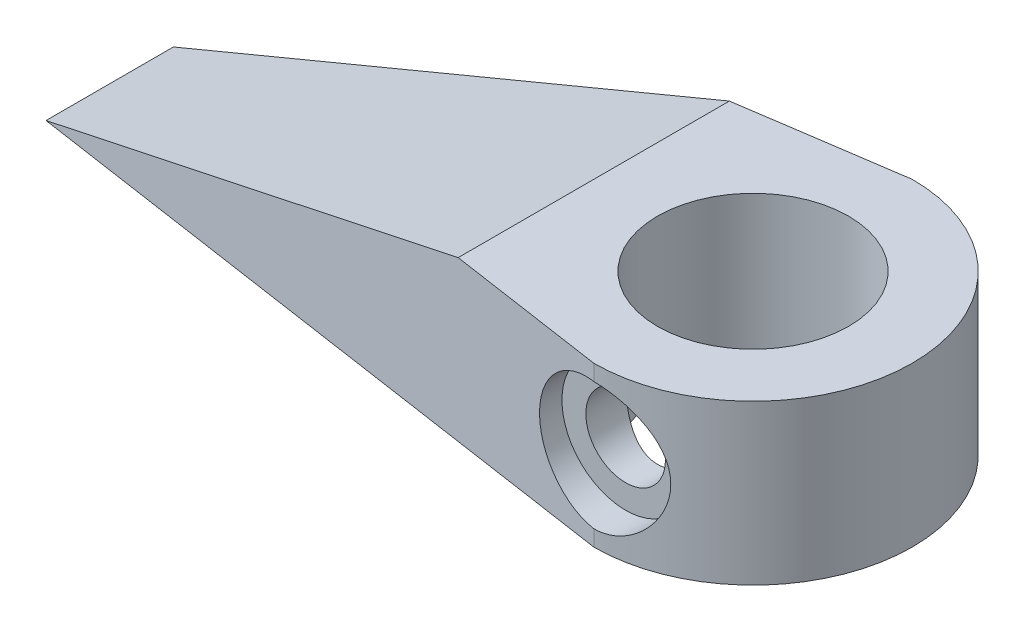
ISO-10303-21;
HEADER;
FILE_DESCRIPTION(('STEP AP214'),'2;1');
FILE_NAME('part.step','',(''),(''),'','','');
FILE_SCHEMA(('AUTOMOTIVE_DESIGN { 1 0 10303 214 1 1 1 1 }'));
ENDSEC;
DATA;
#1=APPLICATION_CONTEXT('core data for automotive mechanical design processes');
#2=APPLICATION_PROTOCOL_DEFINITION('international standard','automotive_design',2000,#1);
#3=PRODUCT_CONTEXT('',#1,'mechanical');
#4=PRODUCT('Part','Part','',(#3));
#5=PRODUCT_RELATED_PRODUCT_CATEGORY('part','',(#4));
#6=PRODUCT_DEFINITION_FORMATION('','',#4);
#7=PRODUCT_DEFINITION_CONTEXT('part definition',#1,'design');
#8=PRODUCT_DEFINITION('design','',#6,#7);
#9=PRODUCT_DEFINITION_SHAPE('','',#8);
#10=(LENGTH_UNIT() NAMED_UNIT(*) SI_UNIT(.MILLI.,.METRE.));
#11=(NAMED_UNIT(*) PLANE_ANGLE_UNIT() SI_UNIT($,.RADIAN.));
#12=(NAMED_UNIT(*) SI_UNIT($,.STERADIAN.) SOLID_ANGLE_UNIT());
#13=UNCERTAINTY_MEASURE_WITH_UNIT(LENGTH_MEASURE(1.E-05),#10,'distance_accuracy_value','');
#14=(GEOMETRIC_REPRESENTATION_CONTEXT(3) GLOBAL_UNCERTAINTY_ASSIGNED_CONTEXT((#13)) GLOBAL_UNIT_ASSIGNED_CONTEXT((#10,
#11,#12)) REPRESENTATION_CONTEXT('',''));
#15=CARTESIAN_POINT('',(0.,0.,0.));
#16=DIRECTION('',(0.,0.,1.));
#17=DIRECTION('',(1.,0.,0.));
#18=AXIS2_PLACEMENT_3D('',#15,#16,#17);
#19=CARTESIAN_POINT('',(20.1986841535707,2.5,-3.001));
#20=DIRECTION('',(0.,0.,1.));
#21=DIRECTION('',(1.,0.,0.));
#22=AXIS2_PLACEMENT_3D('',#19,#20,#21);
#23=CYLINDRICAL_SURFACE('',#22,1.25);
#24=CARTESIAN_POINT('',(21.4486841535707,2.5,4.72717802865892));
#25=CARTESIAN_POINT('',(21.4486767442363,2.43332810910315,4.72718519563219));
#26=CARTESIAN_POINT('',(21.4433161923857,2.36654734317378,4.729658595344));
#27=CARTESIAN_POINT('',(21.4220809430485,2.23491305794286,4.73923833650883));
#28=CARTESIAN_POINT('',(21.4061776936034,2.17006527332476,4.74635725824266));
#29=CARTESIAN_POINT('',(21.3645840377652,2.04443887030893,4.76426917574767));
#30=CARTESIAN_POINT('',(21.3389335278849,1.98364483628498,4.77504717562615));
#31=CARTESIAN_POINT('',(21.2786905311153,1.86724055042195,4.79904148565792));
#32=CARTESIAN_POINT('',(21.244100159486,1.81162907656688,4.81225721880782));
#33=CARTESIAN_POINT('',(21.1646580362468,1.70367427502653,4.84055762619856));
#34=CARTESIAN_POINT('',(21.1193373917551,1.65169244125591,4.85570568079145));
#35=CARTESIAN_POINT('',(21.0207058293162,1.55579977750244,4.88564295372226));
#36=CARTESIAN_POINT('',(20.9673918449447,1.51189205938699,4.90043203180788));
#37=CARTESIAN_POINT('',(20.851447547368,1.43155046912072,4.92875537930613));
#38=CARTESIAN_POINT('',(20.7885134472543,1.39552337196765,4.9422073997529));
#39=CARTESIAN_POINT('',(20.656816175933,1.3347239794944,4.96556519993425));
#40=CARTESIAN_POINT('',(20.5880556084428,1.30994668803578,4.97547255347156));
#41=CARTESIAN_POINT('',(20.4504526515958,1.27366054124326,4.99017521042366));
#42=CARTESIAN_POINT('',(20.3818007297667,1.26152830509795,4.99520971127466));
#43=CARTESIAN_POINT('',(20.2432633339357,1.24886235884014,5.00046828611204));
#44=CARTESIAN_POINT('',(20.1733783718061,1.24832394411704,5.00069431131014));
#45=CARTESIAN_POINT('',(20.0388913734581,1.25853428093332,4.99645129133056));
#46=CARTESIAN_POINT('',(19.9742266649633,1.26859810052573,4.99226714648663));
#47=CARTESIAN_POINT('',(19.8476012596392,1.29855310263816,4.98006516750308));
#48=CARTESIAN_POINT('',(19.7856407625157,1.31844500963016,4.97204705074576));
#49=CARTESIAN_POINT('',(19.6650460354931,1.36772804089464,4.95279852414028));
#50=CARTESIAN_POINT('',(19.6064769764958,1.39725946287082,4.94152097126084));
#51=CARTESIAN_POINT('',(19.4949723862887,1.46484575670034,4.91685713989805));
#52=CARTESIAN_POINT('',(19.4420388558137,1.50290364084498,4.90347011666254));
#53=CARTESIAN_POINT('',(19.3393432418627,1.58958242040462,4.8748169877706));
#54=CARTESIAN_POINT('',(19.2900677162544,1.63875879127901,4.85948494356009));
#55=CARTESIAN_POINT('',(19.200252738643,1.74471144070658,4.8293786068147));
#56=CARTESIAN_POINT('',(19.1597166577464,1.80149063829209,4.8146045313137));
#57=CARTESIAN_POINT('',(19.08728226107,1.92339503666191,4.78681612355338));
#58=CARTESIAN_POINT('',(19.0557116200153,1.98873320574328,4.77387558556714));
#59=CARTESIAN_POINT('',(19.0042198329867,2.1244810449745,4.7520984422101));
#60=CARTESIAN_POINT('',(18.9842903572975,2.19488704826954,4.74325890334593));
#61=CARTESIAN_POINT('',(18.9578839018894,2.333896808914,4.73141212519723));
#62=CARTESIAN_POINT('',(18.950618007242,2.40232112225905,4.72806369197116));
#63=CARTESIAN_POINT('',(18.9474278483807,2.5394784824115,4.72660286810641));
#64=CARTESIAN_POINT('',(18.9514996603892,2.60821141419171,4.72848866599318));
#65=CARTESIAN_POINT('',(18.9701493779151,2.73939838543045,4.73693131345748));
#66=CARTESIAN_POINT('',(18.9840379653902,2.8019726867868,4.74318138016617));
#67=CARTESIAN_POINT('',(19.0210135679284,2.92385129649787,4.75925630297446));
#68=CARTESIAN_POINT('',(19.0441027330394,2.98315483683071,4.7690819946016));
#69=CARTESIAN_POINT('',(19.0999089455188,3.09961531035647,4.79170797856999));
#70=CARTESIAN_POINT('',(19.1329923205087,3.15657497461032,4.80461662202281));
#71=CARTESIAN_POINT('',(19.2074833691847,3.26440805249902,4.83180003740793));
#72=CARTESIAN_POINT('',(19.2488946456947,3.31527881670187,4.84607539920582));
#73=CARTESIAN_POINT('',(19.3428396978552,3.413800134884,4.87578619784532));
#74=CARTESIAN_POINT('',(19.3960044920909,3.46085139995066,4.89122146708841));
#75=CARTESIAN_POINT('',(19.5098326410171,3.54547229197933,4.92043361183923));
#76=CARTESIAN_POINT('',(19.570496544767,3.5830412240637,4.93421036577013));
#77=CARTESIAN_POINT('',(19.6980294727673,3.64758987544358,4.95864251585649));
#78=CARTESIAN_POINT('',(19.7649139839322,3.67454224128948,4.96928983138825));
#79=CARTESIAN_POINT('',(19.9028253184162,3.71661679233443,4.98618173103365));
#80=CARTESIAN_POINT('',(19.9738496493455,3.73174601822607,4.99242893519919));
#81=CARTESIAN_POINT('',(20.1126676200643,3.74885812552031,4.99951534797509));
#82=CARTESIAN_POINT('',(20.1803400687768,3.75168599969697,5.00070204534225));
#83=CARTESIAN_POINT('',(20.315170965285,3.74638685870606,4.99849523480952));
#84=CARTESIAN_POINT('',(20.3823295011118,3.73826176398713,4.99510252984312));
#85=CARTESIAN_POINT('',(20.5117706360199,3.71189392784134,4.98430065981734));
#86=CARTESIAN_POINT('',(20.5741416914142,3.69402031953045,4.97703824209233));
#87=CARTESIAN_POINT('',(20.694976384072,3.64906575279087,4.95929499847057));
#88=CARTESIAN_POINT('',(20.7534392765565,3.6219830453351,4.94881356124206));
#89=CARTESIAN_POINT('',(20.8677087190494,3.55801047078554,4.92505825398662));
#90=CARTESIAN_POINT('',(20.9232758115473,3.52073269857601,4.91167959188765));
#91=CARTESIAN_POINT('',(21.0276028292094,3.43799281712811,4.8837156187423));
#92=CARTESIAN_POINT('',(21.0763602153567,3.39252766959325,4.86912986083797));
#93=CARTESIAN_POINT('',(21.1691339408022,3.2910551741456,4.8391484525914));
#94=CARTESIAN_POINT('',(21.2126019072191,3.23454098537888,4.82376522857895));
#95=CARTESIAN_POINT('',(21.2895174766374,3.11454125931981,4.79495552690185));
#96=CARTESIAN_POINT('',(21.3229594781382,3.05105185194186,4.78153014522557));
#97=CARTESIAN_POINT('',(21.3785118140064,2.91905616497725,4.75842557732642));
#98=CARTESIAN_POINT('',(21.4006823898992,2.85057884120679,4.74872654469864));
#99=CARTESIAN_POINT('',(21.4329197181087,2.71046042614933,4.73440803066667));
#100=CARTESIAN_POINT('',(21.4430270687828,2.6388307927257,4.7297715160498));
#101=CARTESIAN_POINT('',(21.4480888028072,2.54464147573811,4.72744979732687));
#102=CARTESIAN_POINT('',(21.4486866347819,2.52232684261197,4.72717562860874));
#103=CARTESIAN_POINT('',(21.4486841535707,2.5,4.72717802865892));
#104=B_SPLINE_CURVE_WITH_KNOTS('',3,(#24,#25,#26,#27,#28,#29,#30,#31,#32,#33,#34,#35,#36,#37,
#38,#39,#40,#41,#42,#43,#44,#45,#46,#47,#48,#49,#50,#51,#52,#53,#54,#55,#56,#57,#58,#59,#60,#61,
#62,#63,#64,#65,#66,#67,#68,#69,#70,#71,#72,#73,#74,#75,#76,#77,#78,#79,#80,#81,#82,#83,#84,#85,
#86,#87,#88,#89,#90,#91,#92,#93,#94,#95,#96,#97,#98,#99,#100,#101,#102,#103),.UNSPECIFIED.,.T.,
.F.,(4,2,2,2,2,2,2,2,2,2,2,2,2,2,2,2,2,2,2,2,2,2,2,2,2,2,2,2,2,2,2,2,2,2,2,2,2,2,2,4),(0.,
0.199951711985515,0.400447161842176,0.600130652152112,0.799766938550101,1.01066841430654,
1.2216510045991,1.44178476577924,1.66182066774891,1.87040605977952,2.07890680917931,
2.27471840245093,2.47054443201884,2.66935814640065,2.86824221022484,3.08114531844485,
3.29413040441367,3.51411545666722,3.73394290745569,3.93950778306308,4.14500152518449,
4.33733901066192,4.5297214691353,4.73025126818169,4.93086800795466,5.14781662735514,
5.36478114041867,5.58230105955595,5.79969134643008,6.00188635094055,6.20404590801915,
6.39903415036488,6.59405944632174,6.79789862829037,7.00181361048905,7.21960426908078,
7.4375163813919,7.65425125796866,7.87025464546164,7.93721375436707),.UNSPECIFIED.);
#105=CARTESIAN_POINT('',(21.4486841535707,2.5,4.72717802865892));
#106=VERTEX_POINT('',#105);
#107=EDGE_CURVE('E121',#106,#106,#104,.T.);
#108=ORIENTED_EDGE('',*,*,#107,.T.);
#109=EDGE_LOOP('',(#108));
#110=FACE_BOUND('',#109,.T.);
#111=CARTESIAN_POINT('',(20.1986841535707,2.5,6.));
#112=DIRECTION('',(0.,0.,1.));
#113=DIRECTION('',(1.,0.,0.));
#114=AXIS2_PLACEMENT_3D('',#111,#112,#113);
#115=CIRCLE('',#114,1.25);
#116=CARTESIAN_POINT('',(21.4486841535707,2.5,6.));
#117=VERTEX_POINT('',#116);
#118=EDGE_CURVE('E116',#117,#117,#115,.F.);
#119=ORIENTED_EDGE('',*,*,#118,.F.);
#120=EDGE_LOOP('',(#119));
#121=FACE_BOUND('',#120,.T.);
#122=ADVANCED_FACE('F33',(#110,#121),#23,.F.);
#123=CARTESIAN_POINT('',(0.,5.,4.));
#124=DIRECTION('',(0.146912950004832,0.,-0.989149425072308));
#125=DIRECTION('',(-0.989149425072308,0.,-0.146912950004832));
#126=AXIS2_PLACEMENT_3D('',#123,#124,#125);
#127=PLANE('',#126);
#128=DIRECTION('',(0.,-1.,0.));
#129=VECTOR('',#128,1.);
#130=CARTESIAN_POINT('',(20.1986841535707,5.,7.));
#131=LINE('',#130,#129);
#132=CARTESIAN_POINT('',(20.1986841535707,0.499999999999997,7.));
#133=VERTEX_POINT('',#132);
#134=CARTESIAN_POINT('',(20.1986841535707,0.,7.));
#135=VERTEX_POINT('',#134);
#136=EDGE_CURVE('E78',#133,#135,#131,.T.);
#137=ORIENTED_EDGE('',*,*,#136,.F.);
#138=CARTESIAN_POINT('',(20.1986841535707,2.5,7.));
#139=DIRECTION('',(0.146912950004832,0.,-0.989149425072308));
#140=DIRECTION('',(0.989149425072308,0.,0.146912950004832));
#141=AXIS2_PLACEMENT_3D('',#138,#139,#140);
#142=ELLIPSE('',#141,2.02193920281943,2.);
#143=CARTESIAN_POINT('',(20.1986841535707,4.5,7.));
#144=VERTEX_POINT('',#143);
#145=EDGE_CURVE('E53',#133,#144,#142,.T.);
#146=ORIENTED_EDGE('',*,*,#145,.T.);
#147=CARTESIAN_POINT('',(20.1986841535707,5.,7.));
#148=VERTEX_POINT('',#147);
#149=EDGE_CURVE('E86',#148,#144,#131,.T.);
#150=ORIENTED_EDGE('',*,*,#149,.F.);
#151=DIRECTION('',(0.989149425072308,0.,0.146912950004832));
#152=VECTOR('',#151,1.);
#153=CARTESIAN_POINT('',(0.,5.,4.));
#154=LINE('',#153,#152);
#155=CARTESIAN_POINT('',(15.1986841535707,5.,6.25737736745845));
#156=VERTEX_POINT('',#155);
#157=EDGE_CURVE('E61',#156,#148,#154,.T.);
#158=ORIENTED_EDGE('',*,*,#157,.F.);
#159=DIRECTION('',(-0.940602408551378,-0.30943547449481,-0.13970252736267));
#160=VECTOR('',#159,1.);
#161=CARTESIAN_POINT('',(15.296399538862,5.03214600168803,6.27189049879142));
#162=LINE('',#161,#160);
#163=CARTESIAN_POINT('',(0.,0.,4.));
#164=VERTEX_POINT('',#163);
#165=EDGE_CURVE('E94',#156,#164,#162,.T.);
#166=ORIENTED_EDGE('',*,*,#165,.T.);
#167=DIRECTION('',(0.989149425072308,0.,0.146912950004832));
#168=VECTOR('',#167,1.);
#169=CARTESIAN_POINT('',(0.,0.,4.));
#170=LINE('',#169,#168);
#171=EDGE_CURVE('E90',#164,#135,#170,.T.);
#172=ORIENTED_EDGE('',*,*,#171,.T.);
#173=EDGE_LOOP('',(#137,#146,#150,#158,#166,#172));
#174=FACE_BOUND('',#173,.T.);
#175=ADVANCED_FACE('F91',(#174),#127,.F.);
#176=CARTESIAN_POINT('',(20.1986841535707,5.,2.));
#177=DIRECTION('',(0.,1.,0.));
#178=DIRECTION('',(0.,0.,1.));
#179=AXIS2_PLACEMENT_3D('',#176,#177,#178);
#180=PLANE('',#179);
#181=CARTESIAN_POINT('',(20.1986841535707,5.,2.));
#182=DIRECTION('',(0.,1.,0.));
#183=DIRECTION('',(0.,0.,1.));
#184=AXIS2_PLACEMENT_3D('',#181,#182,#183);
#185=CIRCLE('',#184,2.99999999999999);
#186=CARTESIAN_POINT('',(20.1986841535707,5.,4.99999999999999));
#187=VERTEX_POINT('',#186);
#188=EDGE_CURVE('E165',#187,#187,#185,.T.);
#189=ORIENTED_EDGE('',*,*,#188,.F.);
#190=EDGE_LOOP('',(#189));
#191=FACE_BOUND('',#190,.T.);
#192=DIRECTION('',(0.,0.,-1.));
#193=VECTOR('',#192,1.);
#194=CARTESIAN_POINT('',(15.1986841535707,5.,4.));
#195=LINE('',#194,#193);
#196=CARTESIAN_POINT('',(15.1986841535707,5.,-2.25737736745845));
#197=VERTEX_POINT('',#196);
#198=EDGE_CURVE('E47',#156,#197,#195,.T.);
#199=ORIENTED_EDGE('',*,*,#198,.F.);
#200=ORIENTED_EDGE('',*,*,#157,.T.);
#201=CARTESIAN_POINT('',(20.1986841535707,5.,2.));
#202=DIRECTION('',(0.,1.,0.));
#203=DIRECTION('',(0.,0.,1.));
#204=AXIS2_PLACEMENT_3D('',#201,#202,#203);
#205=CIRCLE('',#204,5.);
#206=CARTESIAN_POINT('',(20.1986841535707,5.,-3.));
#207=VERTEX_POINT('',#206);
#208=EDGE_CURVE('E98',#148,#207,#205,.T.);
#209=ORIENTED_EDGE('',*,*,#208,.T.);
#210=DIRECTION('',(-0.989149425072308,0.,0.146912950004832));
#211=VECTOR('',#210,1.);
#212=CARTESIAN_POINT('',(20.1986841535707,5.,-3.));
#213=LINE('',#212,#211);
#214=EDGE_CURVE('E171',#207,#197,#213,.T.);
#215=ORIENTED_EDGE('',*,*,#214,.T.);
#216=EDGE_LOOP('',(#199,#200,#209,#215));
#217=FACE_BOUND('',#216,.T.);
#218=ADVANCED_FACE('F154',(#191,#217),#180,.T.);
#219=CARTESIAN_POINT('',(20.1986841535707,5.,2.));
#220=DIRECTION('',(0.,-1.,0.));
#221=DIRECTION('',(0.,0.,-1.));
#222=AXIS2_PLACEMENT_3D('',#219,#220,#221);
#223=CYLINDRICAL_SURFACE('',#222,5.);
#224=ORIENTED_EDGE('',*,*,#149,.T.);
#225=CARTESIAN_POINT('',(20.1986841535707,4.5,7.));
#226=CARTESIAN_POINT('',(20.2526647802389,4.50000757612106,7.00000805763621));
#227=CARTESIAN_POINT('',(20.3066403830812,4.49781474735574,6.99912602693014));
#228=CARTESIAN_POINT('',(20.4141679680155,4.48908712538834,6.99564193189763));
#229=CARTESIAN_POINT('',(20.467720070839,4.48255361836372,6.99304037708104));
#230=CARTESIAN_POINT('',(20.5738373106628,4.46523316284698,6.9861890755517));
#231=CARTESIAN_POINT('',(20.6264052019282,4.45446087364112,6.98194501007588));
#232=CARTESIAN_POINT('',(20.7303585374574,4.42878009298815,6.97192661884838));
#233=CARTESIAN_POINT('',(20.7817439342185,4.41387143568991,6.96615223173758));
#234=CARTESIAN_POINT('',(20.9335277111802,4.36315682499852,6.94675261128721));
#235=CARTESIAN_POINT('',(21.0317247147096,4.32133391774657,6.93103917625701));
#236=CARTESIAN_POINT('',(21.2196752080337,4.22303722678069,6.89558622738759));
#237=CARTESIAN_POINT('',(21.3094225698299,4.16655291991827,6.87584382396056));
#238=CARTESIAN_POINT('',(21.4821858343168,4.03776195002377,6.83330792428328));
#239=CARTESIAN_POINT('',(21.5647544459112,3.96488555447525,6.81042050266665));
#240=CARTESIAN_POINT('',(21.7168679962763,3.80659024216399,6.76460315836735));
#241=CARTESIAN_POINT('',(21.7864080105461,3.72116660451772,6.74167322290928));
#242=CARTESIAN_POINT('',(21.9135590325596,3.53557108292238,6.69722771592718));
#243=CARTESIAN_POINT('',(21.970500174087,3.4349115426454,6.67582074215261));
#244=CARTESIAN_POINT('',(22.0664397355134,3.22446140078645,6.63833614643881));
#245=CARTESIAN_POINT('',(22.1054470305728,3.11467534759654,6.62225588950022));
#246=CARTESIAN_POINT('',(22.162582664996,2.89428879179051,6.59826369961633));
#247=CARTESIAN_POINT('',(22.1815777204367,2.78395106182393,6.59001437373782));
#248=CARTESIAN_POINT('',(22.200857112803,2.5613673349673,6.58164004471936));
#249=CARTESIAN_POINT('',(22.2011502636126,2.44912226192426,6.58151121453067));
#250=CARTESIAN_POINT('',(22.1836734495679,2.23424244549628,6.58910503384357));
#251=CARTESIAN_POINT('',(22.1671591906613,2.13148253395898,6.59628187348234));
#252=CARTESIAN_POINT('',(22.1186304834327,1.93033876537817,6.6167621022076));
#253=CARTESIAN_POINT('',(22.0866135938218,1.83195560023147,6.63006645621313));
#254=CARTESIAN_POINT('',(22.0073790998105,1.63998263320185,6.6615947741056));
#255=CARTESIAN_POINT('',(21.9598645529857,1.54653166810754,6.67991361547152));
#256=CARTESIAN_POINT('',(21.8511911227974,1.36858498847946,6.71938096154124));
#257=CARTESIAN_POINT('',(21.7900269843222,1.28409274159583,6.74053055482985));
#258=CARTESIAN_POINT('',(21.6502392527796,1.11959522074492,6.78526602599719));
#259=CARTESIAN_POINT('',(21.5706320353416,1.04044052053282,6.8089139075487));
#260=CARTESIAN_POINT('',(21.3990080162022,0.896322943925154,6.85459570738408));
#261=CARTESIAN_POINT('',(21.3069873225224,0.8313645352745,6.87662911612783));
#262=CARTESIAN_POINT('',(21.1107150727536,0.71635283656239,6.91715738086101));
#263=CARTESIAN_POINT('',(21.0062537789088,0.66662759376089,6.93557165179856));
#264=CARTESIAN_POINT('',(20.7895734367337,0.585798149426925,6.96616116889859));
#265=CARTESIAN_POINT('',(20.6773666138489,0.554665319105956,6.97834600302599));
#266=CARTESIAN_POINT('',(20.5031436282884,0.522363860870892,6.99108709545315));
#267=CARTESIAN_POINT('',(20.4425811754384,0.513986740716967,6.99441770109887));
#268=CARTESIAN_POINT('',(20.3209193241597,0.502805102550978,6.99887741091997));
#269=CARTESIAN_POINT('',(20.2598204564071,0.499995590013065,7.00000848820606));
#270=CARTESIAN_POINT('',(20.1986841535707,0.499999999999997,7.));
#271=B_SPLINE_CURVE_WITH_KNOTS('',3,(#225,#226,#227,#228,#229,#230,#231,#232,#233,#234,#235,
#236,#237,#238,#239,#240,#241,#242,#243,#244,#245,#246,#247,#248,#249,#250,#251,#252,#253,#254,
#255,#256,#257,#258,#259,#260,#261,#262,#263,#264,#265,#266,#267,#268,#269,#270),.UNSPECIFIED.,
.F.,.F.,(4,2,2,2,2,2,2,2,2,2,2,2,2,2,2,2,2,2,2,2,2,2,4),(0.,0.161881699776071,0.323715454098166,
0.484994377834128,0.64627976911791,0.968335833524883,1.29062369438736,1.62658853539795,
1.96268010808688,2.31375221300834,2.6646503907124,2.99963374319028,3.33445922264529,
3.64598209038221,3.95755403139017,4.27548589687981,4.59354037839973,4.93615989626569,
5.2788870858639,5.62854632302333,5.9776657536759,6.1610921516541,6.34435392895353),.UNSPECIFIED.);
#272=EDGE_CURVE('E11',#144,#133,#271,.T.);
#273=ORIENTED_EDGE('',*,*,#272,.T.);
#274=ORIENTED_EDGE('',*,*,#136,.T.);
#275=CARTESIAN_POINT('',(20.1986841535707,0.,2.));
#276=DIRECTION('',(0.,1.,0.));
#277=DIRECTION('',(0.,0.,1.));
#278=AXIS2_PLACEMENT_3D('',#275,#276,#277);
#279=CIRCLE('',#278,5.);
#280=CARTESIAN_POINT('',(20.1986841535707,0.,-3.));
#281=VERTEX_POINT('',#280);
#282=EDGE_CURVE('E84',#135,#281,#279,.T.);
#283=ORIENTED_EDGE('',*,*,#282,.T.);
#284=DIRECTION('',(0.,-1.,0.));
#285=VECTOR('',#284,1.);
#286=CARTESIAN_POINT('',(20.1986841535707,5.,-3.));
#287=LINE('',#286,#285);
#288=EDGE_CURVE('E111',#207,#281,#287,.T.);
#289=ORIENTED_EDGE('',*,*,#288,.F.);
#290=ORIENTED_EDGE('',*,*,#208,.F.);
#291=EDGE_LOOP('',(#224,#273,#274,#283,#289,#290));
#292=FACE_BOUND('',#291,.T.);
#293=ADVANCED_FACE('F81',(#292),#223,.T.);
#294=CARTESIAN_POINT('',(20.1986841535707,5.,-3.));
#295=DIRECTION('',(0.146912950004832,0.,0.989149425072308));
#296=DIRECTION('',(0.989149425072308,0.,-0.146912950004832));
#297=AXIS2_PLACEMENT_3D('',#294,#295,#296);
#298=PLANE('',#297);
#299=DIRECTION('',(-0.989149425072308,0.,0.146912950004832));
#300=VECTOR('',#299,1.);
#301=CARTESIAN_POINT('',(20.1986841535707,0.,-3.));
#302=LINE('',#301,#300);
#303=CARTESIAN_POINT('',(0.,0.,0.));
#304=VERTEX_POINT('',#303);
#305=EDGE_CURVE('E99',#281,#304,#302,.T.);
#306=ORIENTED_EDGE('',*,*,#305,.T.);
#307=DIRECTION('',(-0.940602408551378,-0.30943547449481,0.13970252736267));
#308=VECTOR('',#307,1.);
#309=CARTESIAN_POINT('',(15.296399538862,5.03214600168803,-2.27189049879142));
#310=LINE('',#309,#308);
#311=EDGE_CURVE('E103',#197,#304,#310,.T.);
#312=ORIENTED_EDGE('',*,*,#311,.F.);
#313=ORIENTED_EDGE('',*,*,#214,.F.);
#314=ORIENTED_EDGE('',*,*,#288,.T.);
#315=EDGE_LOOP('',(#306,#312,#313,#314));
#316=FACE_BOUND('',#315,.T.);
#317=ADVANCED_FACE('F177',(#316),#298,.F.);
#318=CARTESIAN_POINT('',(15.1986841535707,0.,4.));
#319=DIRECTION('',(0.,1.,0.));
#320=DIRECTION('',(0.,0.,1.));
#321=AXIS2_PLACEMENT_3D('',#318,#319,#320);
#322=PLANE('',#321);
#323=CARTESIAN_POINT('',(20.1986841535707,0.,2.));
#324=DIRECTION('',(0.,1.,0.));
#325=DIRECTION('',(0.,0.,1.));
#326=AXIS2_PLACEMENT_3D('',#323,#324,#325);
#327=CIRCLE('',#326,2.99999999999999);
#328=CARTESIAN_POINT('',(20.1986841535707,0.,4.99999999999999));
#329=VERTEX_POINT('',#328);
#330=EDGE_CURVE('E106',#329,#329,#327,.F.);
#331=ORIENTED_EDGE('',*,*,#330,.F.);
#332=EDGE_LOOP('',(#331));
#333=FACE_BOUND('',#332,.T.);
#334=DIRECTION('',(0.,0.,-1.));
#335=VECTOR('',#334,1.);
#336=CARTESIAN_POINT('',(0.,0.,4.));
#337=LINE('',#336,#335);
#338=EDGE_CURVE('E113',#164,#304,#337,.T.);
#339=ORIENTED_EDGE('',*,*,#338,.T.);
#340=ORIENTED_EDGE('',*,*,#305,.F.);
#341=ORIENTED_EDGE('',*,*,#282,.F.);
#342=ORIENTED_EDGE('',*,*,#171,.F.);
#343=EDGE_LOOP('',(#339,#340,#341,#342));
#344=FACE_BOUND('',#343,.T.);
#345=ADVANCED_FACE('F35',(#333,#344),#322,.F.);
#346=CARTESIAN_POINT('',(0.,0.,4.));
#347=DIRECTION('',(0.3125,-0.949917759598167,0.));
#348=DIRECTION('',(0.949917759598167,0.3125,0.));
#349=AXIS2_PLACEMENT_3D('',#346,#347,#348);
#350=PLANE('',#349);
#351=ORIENTED_EDGE('',*,*,#198,.T.);
#352=ORIENTED_EDGE('',*,*,#311,.T.);
#353=ORIENTED_EDGE('',*,*,#338,.F.);
#354=ORIENTED_EDGE('',*,*,#165,.F.);
#355=EDGE_LOOP('',(#351,#352,#353,#354));
#356=FACE_BOUND('',#355,.T.);
#357=ADVANCED_FACE('F161',(#356),#350,.F.);
#358=CARTESIAN_POINT('',(20.1986841535707,-0.00100000000000013,2.));
#359=DIRECTION('',(0.,1.,0.));
#360=DIRECTION('',(0.,0.,1.));
#361=AXIS2_PLACEMENT_3D('',#358,#359,#360);
#362=CYLINDRICAL_SURFACE('',#361,2.99999999999999);
#363=ORIENTED_EDGE('',*,*,#107,.F.);
#364=EDGE_LOOP('',(#363));
#365=FACE_BOUND('',#364,.T.);
#366=ORIENTED_EDGE('',*,*,#188,.T.);
#367=EDGE_LOOP('',(#366));
#368=FACE_BOUND('',#367,.T.);
#369=ORIENTED_EDGE('',*,*,#330,.T.);
#370=EDGE_LOOP('',(#369));
#371=FACE_BOUND('',#370,.T.);
#372=ADVANCED_FACE('F144',(#365,#368,#371),#362,.F.);
#373=CARTESIAN_POINT('',(20.1986841535707,2.5,6.));
#374=DIRECTION('',(0.,0.,1.));
#375=DIRECTION('',(1.,0.,0.));
#376=AXIS2_PLACEMENT_3D('',#373,#374,#375);
#377=CYLINDRICAL_SURFACE('',#376,2.);
#378=CARTESIAN_POINT('',(20.1986841535707,2.5,6.));
#379=DIRECTION('',(0.,0.,1.));
#380=DIRECTION('',(1.,0.,0.));
#381=AXIS2_PLACEMENT_3D('',#378,#379,#380);
#382=CIRCLE('',#381,2.);
#383=CARTESIAN_POINT('',(22.1986841535707,2.5,6.));
#384=VERTEX_POINT('',#383);
#385=EDGE_CURVE('E118',#384,#384,#382,.T.);
#386=ORIENTED_EDGE('',*,*,#385,.F.);
#387=EDGE_LOOP('',(#386));
#388=FACE_BOUND('',#387,.T.);
#389=ORIENTED_EDGE('',*,*,#272,.F.);
#390=ORIENTED_EDGE('',*,*,#145,.F.);
#391=EDGE_LOOP('',(#389,#390));
#392=FACE_BOUND('',#391,.T.);
#393=ADVANCED_FACE('F139',(#388,#392),#377,.F.);
#394=CARTESIAN_POINT('',(20.1986841535707,2.5,6.));
#395=DIRECTION('',(0.,0.,1.));
#396=DIRECTION('',(1.,0.,0.));
#397=AXIS2_PLACEMENT_3D('',#394,#395,#396);
#398=PLANE('',#397);
#399=ORIENTED_EDGE('',*,*,#385,.T.);
#400=EDGE_LOOP('',(#399));
#401=FACE_BOUND('',#400,.T.);
#402=ORIENTED_EDGE('',*,*,#118,.T.);
#403=EDGE_LOOP('',(#402));
#404=FACE_BOUND('',#403,.T.);
#405=ADVANCED_FACE('F143',(#401,#404),#398,.T.);
#406=CLOSED_SHELL('',(#122,#175,#218,#293,#317,#345,#357,#372,#393,#405));
#407=MANIFOLD_SOLID_BREP('B2',#406);
#408=ADVANCED_BREP_SHAPE_REPRESENTATION('',(#18,#407),#14);
#409=SHAPE_DEFINITION_REPRESENTATION(#9,#408);
ENDSEC;
END-ISO-10303-21;
